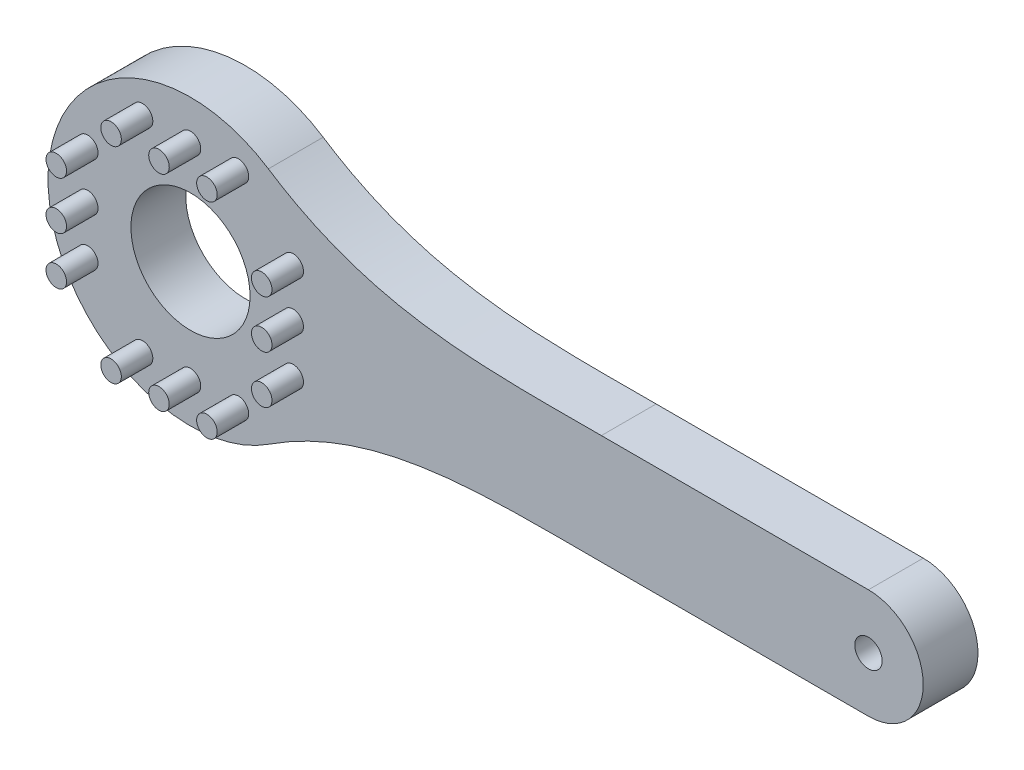
ISO-10303-21;
HEADER;
FILE_DESCRIPTION(('STEP AP214'),'2;1');
FILE_NAME('part.step','',(''),(''),'','','');
FILE_SCHEMA(('AUTOMOTIVE_DESIGN { 1 0 10303 214 1 1 1 1 }'));
ENDSEC;
DATA;
#1=APPLICATION_CONTEXT('core data for automotive mechanical design processes');
#2=APPLICATION_PROTOCOL_DEFINITION('international standard','automotive_design',2000,#1);
#3=PRODUCT_CONTEXT('',#1,'mechanical');
#4=PRODUCT('Part','Part','',(#3));
#5=PRODUCT_RELATED_PRODUCT_CATEGORY('part','',(#4));
#6=PRODUCT_DEFINITION_FORMATION('','',#4);
#7=PRODUCT_DEFINITION_CONTEXT('part definition',#1,'design');
#8=PRODUCT_DEFINITION('design','',#6,#7);
#9=PRODUCT_DEFINITION_SHAPE('','',#8);
#10=(LENGTH_UNIT() NAMED_UNIT(*) SI_UNIT(.MILLI.,.METRE.));
#11=(NAMED_UNIT(*) PLANE_ANGLE_UNIT() SI_UNIT($,.RADIAN.));
#12=(NAMED_UNIT(*) SI_UNIT($,.STERADIAN.) SOLID_ANGLE_UNIT());
#13=UNCERTAINTY_MEASURE_WITH_UNIT(LENGTH_MEASURE(1.E-05),#10,'distance_accuracy_value','');
#14=(GEOMETRIC_REPRESENTATION_CONTEXT(3) GLOBAL_UNCERTAINTY_ASSIGNED_CONTEXT((#13)) GLOBAL_UNIT_ASSIGNED_CONTEXT((#10,
#11,#12)) REPRESENTATION_CONTEXT('',''));
#15=CARTESIAN_POINT('',(0.,0.,0.));
#16=DIRECTION('',(0.,0.,1.));
#17=DIRECTION('',(1.,0.,0.));
#18=AXIS2_PLACEMENT_3D('',#15,#16,#17);
#19=CARTESIAN_POINT('',(17.4647591380404,4.46248690203293,4.));
#20=DIRECTION('',(0.,0.,-1.));
#21=DIRECTION('',(-1.,0.,0.));
#22=AXIS2_PLACEMENT_3D('',#19,#20,#21);
#23=PLANE('',#22);
#24=CARTESIAN_POINT('',(-7.5,3.5,4.));
#25=DIRECTION('',(0.,0.,-1.));
#26=DIRECTION('',(-1.,0.,0.));
#27=AXIS2_PLACEMENT_3D('',#24,#25,#26);
#28=CIRCLE('',#27,0.75);
#29=CARTESIAN_POINT('',(-8.25,3.5,4.));
#30=VERTEX_POINT('',#29);
#31=EDGE_CURVE('E11',#30,#30,#28,.F.);
#32=ORIENTED_EDGE('',*,*,#31,.F.);
#33=EDGE_LOOP('',(#32));
#34=FACE_BOUND('',#33,.T.);
#35=CARTESIAN_POINT('',(-7.5,0.,4.));
#36=DIRECTION('',(0.,0.,-1.));
#37=DIRECTION('',(-1.,0.,0.));
#38=AXIS2_PLACEMENT_3D('',#35,#36,#37);
#39=CIRCLE('',#38,0.749999999999998);
#40=CARTESIAN_POINT('',(-8.25,0.,4.));
#41=VERTEX_POINT('',#40);
#42=EDGE_CURVE('E49',#41,#41,#39,.F.);
#43=ORIENTED_EDGE('',*,*,#42,.F.);
#44=EDGE_LOOP('',(#43));
#45=FACE_BOUND('',#44,.T.);
#46=CARTESIAN_POINT('',(-7.5,-3.5,4.));
#47=DIRECTION('',(0.,0.,-1.));
#48=DIRECTION('',(-1.,0.,0.));
#49=AXIS2_PLACEMENT_3D('',#46,#47,#48);
#50=CIRCLE('',#49,0.75);
#51=CARTESIAN_POINT('',(-8.25,-3.5,4.));
#52=VERTEX_POINT('',#51);
#53=EDGE_CURVE('E183',#52,#52,#50,.F.);
#54=ORIENTED_EDGE('',*,*,#53,.F.);
#55=EDGE_LOOP('',(#54));
#56=FACE_BOUND('',#55,.T.);
#57=CARTESIAN_POINT('',(7.5,-3.5,4.));
#58=DIRECTION('',(0.,0.,-1.));
#59=DIRECTION('',(-1.,0.,0.));
#60=AXIS2_PLACEMENT_3D('',#57,#58,#59);
#61=CIRCLE('',#60,0.75);
#62=CARTESIAN_POINT('',(6.75,-3.5,4.));
#63=VERTEX_POINT('',#62);
#64=EDGE_CURVE('E180',#63,#63,#61,.F.);
#65=ORIENTED_EDGE('',*,*,#64,.F.);
#66=EDGE_LOOP('',(#65));
#67=FACE_BOUND('',#66,.T.);
#68=CARTESIAN_POINT('',(7.5,0.,4.));
#69=DIRECTION('',(0.,0.,-1.));
#70=DIRECTION('',(-1.,0.,0.));
#71=AXIS2_PLACEMENT_3D('',#68,#69,#70);
#72=CIRCLE('',#71,0.749999999999998);
#73=CARTESIAN_POINT('',(6.75,0.,4.));
#74=VERTEX_POINT('',#73);
#75=EDGE_CURVE('E177',#74,#74,#72,.F.);
#76=ORIENTED_EDGE('',*,*,#75,.F.);
#77=EDGE_LOOP('',(#76));
#78=FACE_BOUND('',#77,.T.);
#79=CARTESIAN_POINT('',(-3.5,-7.5,4.));
#80=DIRECTION('',(0.,0.,-1.));
#81=DIRECTION('',(-1.,0.,0.));
#82=AXIS2_PLACEMENT_3D('',#79,#80,#81);
#83=CIRCLE('',#82,0.749999999999999);
#84=CARTESIAN_POINT('',(-4.25,-7.5,4.));
#85=VERTEX_POINT('',#84);
#86=EDGE_CURVE('E174',#85,#85,#83,.F.);
#87=ORIENTED_EDGE('',*,*,#86,.F.);
#88=EDGE_LOOP('',(#87));
#89=FACE_BOUND('',#88,.T.);
#90=CARTESIAN_POINT('',(0.,-7.5,4.));
#91=DIRECTION('',(0.,0.,-1.));
#92=DIRECTION('',(-1.,0.,0.));
#93=AXIS2_PLACEMENT_3D('',#90,#91,#92);
#94=CIRCLE('',#93,0.75);
#95=CARTESIAN_POINT('',(-0.750000000000001,-7.5,4.));
#96=VERTEX_POINT('',#95);
#97=EDGE_CURVE('E171',#96,#96,#94,.F.);
#98=ORIENTED_EDGE('',*,*,#97,.F.);
#99=EDGE_LOOP('',(#98));
#100=FACE_BOUND('',#99,.T.);
#101=CARTESIAN_POINT('',(3.5,-7.5,4.));
#102=DIRECTION('',(0.,0.,-1.));
#103=DIRECTION('',(-1.,0.,0.));
#104=AXIS2_PLACEMENT_3D('',#101,#102,#103);
#105=CIRCLE('',#104,0.749999999999999);
#106=CARTESIAN_POINT('',(2.75,-7.5,4.));
#107=VERTEX_POINT('',#106);
#108=EDGE_CURVE('E168',#107,#107,#105,.F.);
#109=ORIENTED_EDGE('',*,*,#108,.F.);
#110=EDGE_LOOP('',(#109));
#111=FACE_BOUND('',#110,.T.);
#112=CARTESIAN_POINT('',(-3.5,7.5,4.));
#113=DIRECTION('',(0.,0.,-1.));
#114=DIRECTION('',(-1.,0.,0.));
#115=AXIS2_PLACEMENT_3D('',#112,#113,#114);
#116=CIRCLE('',#115,0.749999999999999);
#117=CARTESIAN_POINT('',(-4.25,7.5,4.));
#118=VERTEX_POINT('',#117);
#119=EDGE_CURVE('E165',#118,#118,#116,.F.);
#120=ORIENTED_EDGE('',*,*,#119,.F.);
#121=EDGE_LOOP('',(#120));
#122=FACE_BOUND('',#121,.T.);
#123=CARTESIAN_POINT('',(7.5,3.5,4.));
#124=DIRECTION('',(0.,0.,-1.));
#125=DIRECTION('',(-1.,0.,0.));
#126=AXIS2_PLACEMENT_3D('',#123,#124,#125);
#127=CIRCLE('',#126,0.75);
#128=CARTESIAN_POINT('',(6.75,3.5,4.));
#129=VERTEX_POINT('',#128);
#130=EDGE_CURVE('E162',#129,#129,#127,.F.);
#131=ORIENTED_EDGE('',*,*,#130,.F.);
#132=EDGE_LOOP('',(#131));
#133=FACE_BOUND('',#132,.T.);
#134=CARTESIAN_POINT('',(3.5,7.5,4.));
#135=DIRECTION('',(0.,0.,-1.));
#136=DIRECTION('',(-1.,0.,0.));
#137=AXIS2_PLACEMENT_3D('',#134,#135,#136);
#138=CIRCLE('',#137,0.749999999999999);
#139=CARTESIAN_POINT('',(2.75,7.5,4.));
#140=VERTEX_POINT('',#139);
#141=EDGE_CURVE('E159',#140,#140,#138,.F.);
#142=ORIENTED_EDGE('',*,*,#141,.F.);
#143=EDGE_LOOP('',(#142));
#144=FACE_BOUND('',#143,.T.);
#145=CARTESIAN_POINT('',(0.,7.5,4.));
#146=DIRECTION('',(0.,0.,-1.));
#147=DIRECTION('',(-1.,0.,0.));
#148=AXIS2_PLACEMENT_3D('',#145,#146,#147);
#149=CIRCLE('',#148,0.75);
#150=CARTESIAN_POINT('',(-0.750000000000001,7.5,4.));
#151=VERTEX_POINT('',#150);
#152=EDGE_CURVE('E156',#151,#151,#149,.F.);
#153=ORIENTED_EDGE('',*,*,#152,.F.);
#154=EDGE_LOOP('',(#153));
#155=FACE_BOUND('',#154,.T.);
#156=CARTESIAN_POINT('',(30.,4.,4.));
#157=CARTESIAN_POINT('',(21.2668653818899,4.,4.));
#158=CARTESIAN_POINT('',(13.4104279790372,3.66400440550072,4.));
#159=CARTESIAN_POINT('',(5.68619302154209,8.70788199976125,4.));
#160=B_SPLINE_CURVE_WITH_KNOTS('',3,(#156,#157,#158,#159),.UNSPECIFIED.,.F.,.F.,(4,4),(0.,1.),.UNSPECIFIED.);
#161=CARTESIAN_POINT('',(30.,4.,4.));
#162=VERTEX_POINT('',#161);
#163=CARTESIAN_POINT('',(5.68619302154209,8.70788199976125,4.));
#164=VERTEX_POINT('',#163);
#165=EDGE_CURVE('E147',#162,#164,#160,.T.);
#166=ORIENTED_EDGE('',*,*,#165,.T.);
#167=CARTESIAN_POINT('',(0.,0.,4.));
#168=DIRECTION('',(0.,0.,1.));
#169=DIRECTION('',(1.,0.,0.));
#170=AXIS2_PLACEMENT_3D('',#167,#168,#169);
#171=CIRCLE('',#170,10.4);
#172=CARTESIAN_POINT('',(5.68619302154209,-8.70788199976125,4.));
#173=VERTEX_POINT('',#172);
#174=EDGE_CURVE('E95',#164,#173,#171,.T.);
#175=ORIENTED_EDGE('',*,*,#174,.T.);
#176=CARTESIAN_POINT('',(5.68619302154209,-8.70788199976125,4.));
#177=CARTESIAN_POINT('',(13.4104279790372,-3.66400440550072,4.));
#178=CARTESIAN_POINT('',(21.2668653818899,-4.,4.));
#179=CARTESIAN_POINT('',(30.,-4.,4.));
#180=B_SPLINE_CURVE_WITH_KNOTS('',3,(#176,#177,#178,#179),.UNSPECIFIED.,.F.,.F.,(4,4),(0.,1.),.UNSPECIFIED.);
#181=CARTESIAN_POINT('',(30.,-4.,4.));
#182=VERTEX_POINT('',#181);
#183=EDGE_CURVE('E108',#173,#182,#180,.T.);
#184=ORIENTED_EDGE('',*,*,#183,.T.);
#185=DIRECTION('',(1.,0.,0.));
#186=VECTOR('',#185,1.);
#187=CARTESIAN_POINT('',(30.,-4.,4.));
#188=LINE('',#187,#186);
#189=CARTESIAN_POINT('',(49.5,-4.,4.));
#190=VERTEX_POINT('',#189);
#191=EDGE_CURVE('E102',#182,#190,#188,.T.);
#192=ORIENTED_EDGE('',*,*,#191,.T.);
#193=CARTESIAN_POINT('',(49.5,0.,4.));
#194=DIRECTION('',(0.,0.,1.));
#195=DIRECTION('',(-1.,0.,0.));
#196=AXIS2_PLACEMENT_3D('',#193,#194,#195);
#197=CIRCLE('',#196,4.);
#198=CARTESIAN_POINT('',(49.5,4.,4.));
#199=VERTEX_POINT('',#198);
#200=EDGE_CURVE('E106',#190,#199,#197,.T.);
#201=ORIENTED_EDGE('',*,*,#200,.T.);
#202=DIRECTION('',(-1.,0.,0.));
#203=VECTOR('',#202,1.);
#204=CARTESIAN_POINT('',(30.,4.,4.));
#205=LINE('',#204,#203);
#206=EDGE_CURVE('E57',#199,#162,#205,.T.);
#207=ORIENTED_EDGE('',*,*,#206,.T.);
#208=EDGE_LOOP('',(#166,#175,#184,#192,#201,#207));
#209=FACE_BOUND('',#208,.T.);
#210=CARTESIAN_POINT('',(49.5,0.,4.));
#211=DIRECTION('',(0.,0.,1.));
#212=DIRECTION('',(1.,0.,0.));
#213=AXIS2_PLACEMENT_3D('',#210,#211,#212);
#214=CIRCLE('',#213,0.999999999999998);
#215=CARTESIAN_POINT('',(50.5,0.,4.));
#216=VERTEX_POINT('',#215);
#217=EDGE_CURVE('E132',#216,#216,#214,.T.);
#218=ORIENTED_EDGE('',*,*,#217,.F.);
#219=EDGE_LOOP('',(#218));
#220=FACE_BOUND('',#219,.T.);
#221=CARTESIAN_POINT('',(0.,0.,4.));
#222=DIRECTION('',(0.,0.,1.));
#223=DIRECTION('',(1.,0.,0.));
#224=AXIS2_PLACEMENT_3D('',#221,#222,#223);
#225=CIRCLE('',#224,4.35);
#226=CARTESIAN_POINT('',(4.35,0.,4.));
#227=VERTEX_POINT('',#226);
#228=EDGE_CURVE('E268',#227,#227,#225,.T.);
#229=ORIENTED_EDGE('',*,*,#228,.F.);
#230=EDGE_LOOP('',(#229));
#231=FACE_BOUND('',#230,.T.);
#232=ADVANCED_FACE('F39',(#34,#45,#56,#67,#78,#89,#100,#111,#122,#133,#144,#155,#209,#220,#231),
#23,.F.);
#233=CARTESIAN_POINT('',(17.4647591380404,4.46248690203293,0.));
#234=DIRECTION('',(0.,0.,-1.));
#235=DIRECTION('',(-1.,0.,0.));
#236=AXIS2_PLACEMENT_3D('',#233,#234,#235);
#237=PLANE('',#236);
#238=CARTESIAN_POINT('',(49.5,0.,0.));
#239=DIRECTION('',(0.,0.,1.));
#240=DIRECTION('',(1.,0.,0.));
#241=AXIS2_PLACEMENT_3D('',#238,#239,#240);
#242=CIRCLE('',#241,0.999999999999998);
#243=CARTESIAN_POINT('',(50.5,0.,0.));
#244=VERTEX_POINT('',#243);
#245=EDGE_CURVE('E262',#244,#244,#242,.T.);
#246=ORIENTED_EDGE('',*,*,#245,.T.);
#247=EDGE_LOOP('',(#246));
#248=FACE_BOUND('',#247,.T.);
#249=CARTESIAN_POINT('',(30.,4.,0.));
#250=CARTESIAN_POINT('',(21.2668653818899,4.,0.));
#251=CARTESIAN_POINT('',(13.4104279790372,3.66400440550072,0.));
#252=CARTESIAN_POINT('',(5.68619302154209,8.70788199976125,0.));
#253=B_SPLINE_CURVE_WITH_KNOTS('',3,(#249,#250,#251,#252),.UNSPECIFIED.,.F.,.F.,(4,4),(0.,1.),.UNSPECIFIED.);
#254=CARTESIAN_POINT('',(30.,4.,0.));
#255=VERTEX_POINT('',#254);
#256=CARTESIAN_POINT('',(5.68619302154209,8.70788199976125,0.));
#257=VERTEX_POINT('',#256);
#258=EDGE_CURVE('E126',#255,#257,#253,.T.);
#259=ORIENTED_EDGE('',*,*,#258,.F.);
#260=DIRECTION('',(-1.,0.,0.));
#261=VECTOR('',#260,1.);
#262=CARTESIAN_POINT('',(30.,4.,0.));
#263=LINE('',#262,#261);
#264=CARTESIAN_POINT('',(49.5,4.,0.));
#265=VERTEX_POINT('',#264);
#266=EDGE_CURVE('E86',#265,#255,#263,.T.);
#267=ORIENTED_EDGE('',*,*,#266,.F.);
#268=CARTESIAN_POINT('',(49.5,0.,0.));
#269=DIRECTION('',(0.,0.,1.));
#270=DIRECTION('',(-1.,0.,0.));
#271=AXIS2_PLACEMENT_3D('',#268,#269,#270);
#272=CIRCLE('',#271,4.);
#273=CARTESIAN_POINT('',(49.5,-4.,0.));
#274=VERTEX_POINT('',#273);
#275=EDGE_CURVE('E80',#274,#265,#272,.T.);
#276=ORIENTED_EDGE('',*,*,#275,.F.);
#277=DIRECTION('',(1.,0.,0.));
#278=VECTOR('',#277,1.);
#279=CARTESIAN_POINT('',(30.,-4.,0.));
#280=LINE('',#279,#278);
#281=CARTESIAN_POINT('',(30.,-4.,0.));
#282=VERTEX_POINT('',#281);
#283=EDGE_CURVE('E116',#282,#274,#280,.T.);
#284=ORIENTED_EDGE('',*,*,#283,.F.);
#285=CARTESIAN_POINT('',(5.68619302154209,-8.70788199976125,0.));
#286=CARTESIAN_POINT('',(13.4104279790372,-3.66400440550072,0.));
#287=CARTESIAN_POINT('',(21.2668653818899,-4.,0.));
#288=CARTESIAN_POINT('',(30.,-4.,0.));
#289=B_SPLINE_CURVE_WITH_KNOTS('',3,(#285,#286,#287,#288),.UNSPECIFIED.,.F.,.F.,(4,4),(0.,1.),.UNSPECIFIED.);
#290=CARTESIAN_POINT('',(5.68619302154209,-8.70788199976125,0.));
#291=VERTEX_POINT('',#290);
#292=EDGE_CURVE('E137',#291,#282,#289,.T.);
#293=ORIENTED_EDGE('',*,*,#292,.F.);
#294=CARTESIAN_POINT('',(0.,0.,0.));
#295=DIRECTION('',(0.,0.,1.));
#296=DIRECTION('',(1.,0.,0.));
#297=AXIS2_PLACEMENT_3D('',#294,#295,#296);
#298=CIRCLE('',#297,10.4);
#299=EDGE_CURVE('E131',#257,#291,#298,.T.);
#300=ORIENTED_EDGE('',*,*,#299,.F.);
#301=EDGE_LOOP('',(#259,#267,#276,#284,#293,#300));
#302=FACE_BOUND('',#301,.T.);
#303=CARTESIAN_POINT('',(0.,0.,0.));
#304=DIRECTION('',(0.,0.,1.));
#305=DIRECTION('',(1.,0.,0.));
#306=AXIS2_PLACEMENT_3D('',#303,#304,#305);
#307=CIRCLE('',#306,4.35);
#308=CARTESIAN_POINT('',(4.35,0.,0.));
#309=VERTEX_POINT('',#308);
#310=EDGE_CURVE('E271',#309,#309,#307,.T.);
#311=ORIENTED_EDGE('',*,*,#310,.T.);
#312=EDGE_LOOP('',(#311));
#313=FACE_BOUND('',#312,.T.);
#314=ADVANCED_FACE('F192',(#248,#302,#313),#237,.T.);
#315=DIRECTION('',(0.,0.,-1.));
#316=VECTOR('',#315,1.);
#317=SURFACE_OF_LINEAR_EXTRUSION('',#160,#316);
#318=ORIENTED_EDGE('',*,*,#258,.T.);
#319=DIRECTION('',(0.,0.,-1.));
#320=VECTOR('',#319,1.);
#321=CARTESIAN_POINT('',(5.68619302154209,8.70788199976125,4.));
#322=LINE('',#321,#320);
#323=EDGE_CURVE('E154',#164,#257,#322,.T.);
#324=ORIENTED_EDGE('',*,*,#323,.F.);
#325=ORIENTED_EDGE('',*,*,#165,.F.);
#326=DIRECTION('',(0.,0.,-1.));
#327=VECTOR('',#326,1.);
#328=CARTESIAN_POINT('',(30.,4.,4.));
#329=LINE('',#328,#327);
#330=EDGE_CURVE('E122',#162,#255,#329,.T.);
#331=ORIENTED_EDGE('',*,*,#330,.T.);
#332=EDGE_LOOP('',(#318,#324,#325,#331));
#333=FACE_BOUND('',#332,.T.);
#334=ADVANCED_FACE('F41',(#333),#317,.F.);
#335=CARTESIAN_POINT('',(0.,0.,4.));
#336=DIRECTION('',(0.,0.,-1.));
#337=DIRECTION('',(-1.,0.,0.));
#338=AXIS2_PLACEMENT_3D('',#335,#336,#337);
#339=CYLINDRICAL_SURFACE('',#338,10.4);
#340=ORIENTED_EDGE('',*,*,#299,.T.);
#341=DIRECTION('',(0.,0.,-1.));
#342=VECTOR('',#341,1.);
#343=CARTESIAN_POINT('',(5.68619302154209,-8.70788199976125,4.));
#344=LINE('',#343,#342);
#345=EDGE_CURVE('E151',#173,#291,#344,.T.);
#346=ORIENTED_EDGE('',*,*,#345,.F.);
#347=ORIENTED_EDGE('',*,*,#174,.F.);
#348=ORIENTED_EDGE('',*,*,#323,.T.);
#349=EDGE_LOOP('',(#340,#346,#347,#348));
#350=FACE_BOUND('',#349,.T.);
#351=ADVANCED_FACE('F249',(#350),#339,.T.);
#352=DIRECTION('',(0.,0.,-1.));
#353=VECTOR('',#352,1.);
#354=SURFACE_OF_LINEAR_EXTRUSION('',#180,#353);
#355=ORIENTED_EDGE('',*,*,#292,.T.);
#356=DIRECTION('',(0.,0.,-1.));
#357=VECTOR('',#356,1.);
#358=CARTESIAN_POINT('',(30.,-4.,4.));
#359=LINE('',#358,#357);
#360=EDGE_CURVE('E117',#182,#282,#359,.T.);
#361=ORIENTED_EDGE('',*,*,#360,.F.);
#362=ORIENTED_EDGE('',*,*,#183,.F.);
#363=ORIENTED_EDGE('',*,*,#345,.T.);
#364=EDGE_LOOP('',(#355,#361,#362,#363));
#365=FACE_BOUND('',#364,.T.);
#366=ADVANCED_FACE('F247',(#365),#354,.F.);
#367=CARTESIAN_POINT('',(30.,-4.,4.));
#368=DIRECTION('',(0.,1.,0.));
#369=DIRECTION('',(0.,0.,1.));
#370=AXIS2_PLACEMENT_3D('',#367,#368,#369);
#371=PLANE('',#370);
#372=ORIENTED_EDGE('',*,*,#283,.T.);
#373=DIRECTION('',(0.,0.,-1.));
#374=VECTOR('',#373,1.);
#375=CARTESIAN_POINT('',(49.5,-4.,4.));
#376=LINE('',#375,#374);
#377=EDGE_CURVE('E113',#190,#274,#376,.T.);
#378=ORIENTED_EDGE('',*,*,#377,.F.);
#379=ORIENTED_EDGE('',*,*,#191,.F.);
#380=ORIENTED_EDGE('',*,*,#360,.T.);
#381=EDGE_LOOP('',(#372,#378,#379,#380));
#382=FACE_BOUND('',#381,.T.);
#383=ADVANCED_FACE('F114',(#382),#371,.F.);
#384=CARTESIAN_POINT('',(49.5,0.,4.));
#385=DIRECTION('',(0.,0.,-1.));
#386=DIRECTION('',(-1.,0.,0.));
#387=AXIS2_PLACEMENT_3D('',#384,#385,#386);
#388=CYLINDRICAL_SURFACE('',#387,4.);
#389=ORIENTED_EDGE('',*,*,#275,.T.);
#390=DIRECTION('',(0.,0.,-1.));
#391=VECTOR('',#390,1.);
#392=CARTESIAN_POINT('',(49.5,4.,4.));
#393=LINE('',#392,#391);
#394=EDGE_CURVE('E118',#199,#265,#393,.T.);
#395=ORIENTED_EDGE('',*,*,#394,.F.);
#396=ORIENTED_EDGE('',*,*,#200,.F.);
#397=ORIENTED_EDGE('',*,*,#377,.T.);
#398=EDGE_LOOP('',(#389,#395,#396,#397));
#399=FACE_BOUND('',#398,.T.);
#400=ADVANCED_FACE('F120',(#399),#388,.T.);
#401=CARTESIAN_POINT('',(30.,4.,4.));
#402=DIRECTION('',(0.,-1.,0.));
#403=DIRECTION('',(0.,0.,-1.));
#404=AXIS2_PLACEMENT_3D('',#401,#402,#403);
#405=PLANE('',#404);
#406=ORIENTED_EDGE('',*,*,#266,.T.);
#407=ORIENTED_EDGE('',*,*,#330,.F.);
#408=ORIENTED_EDGE('',*,*,#206,.F.);
#409=ORIENTED_EDGE('',*,*,#394,.T.);
#410=EDGE_LOOP('',(#406,#407,#408,#409));
#411=FACE_BOUND('',#410,.T.);
#412=ADVANCED_FACE('F235',(#411),#405,.F.);
#413=CARTESIAN_POINT('',(49.5,0.,4.));
#414=DIRECTION('',(0.,0.,-1.));
#415=DIRECTION('',(-1.,0.,0.));
#416=AXIS2_PLACEMENT_3D('',#413,#414,#415);
#417=CYLINDRICAL_SURFACE('',#416,0.999999999999998);
#418=ORIENTED_EDGE('',*,*,#217,.T.);
#419=EDGE_LOOP('',(#418));
#420=FACE_BOUND('',#419,.T.);
#421=ORIENTED_EDGE('',*,*,#245,.F.);
#422=EDGE_LOOP('',(#421));
#423=FACE_BOUND('',#422,.T.);
#424=ADVANCED_FACE('F228',(#420,#423),#417,.F.);
#425=CARTESIAN_POINT('',(0.,0.,4.));
#426=DIRECTION('',(0.,0.,-1.));
#427=DIRECTION('',(-1.,0.,0.));
#428=AXIS2_PLACEMENT_3D('',#425,#426,#427);
#429=CYLINDRICAL_SURFACE('',#428,4.35);
#430=ORIENTED_EDGE('',*,*,#228,.T.);
#431=EDGE_LOOP('',(#430));
#432=FACE_BOUND('',#431,.T.);
#433=ORIENTED_EDGE('',*,*,#310,.F.);
#434=EDGE_LOOP('',(#433));
#435=FACE_BOUND('',#434,.T.);
#436=ADVANCED_FACE('F218',(#432,#435),#429,.F.);
#437=CARTESIAN_POINT('',(0.,7.5,6.3));
#438=DIRECTION('',(0.,0.,-1.));
#439=DIRECTION('',(-1.,0.,0.));
#440=AXIS2_PLACEMENT_3D('',#437,#438,#439);
#441=CYLINDRICAL_SURFACE('',#440,0.75);
#442=CARTESIAN_POINT('',(0.,7.5,6.3));
#443=DIRECTION('',(0.,0.,1.));
#444=DIRECTION('',(1.,0.,0.));
#445=AXIS2_PLACEMENT_3D('',#442,#443,#444);
#446=CIRCLE('',#445,0.75);
#447=CARTESIAN_POINT('',(0.749999999999999,7.5,6.3));
#448=VERTEX_POINT('',#447);
#449=EDGE_CURVE('E274',#448,#448,#446,.T.);
#450=ORIENTED_EDGE('',*,*,#449,.F.);
#451=EDGE_LOOP('',(#450));
#452=FACE_BOUND('',#451,.T.);
#453=ORIENTED_EDGE('',*,*,#152,.T.);
#454=EDGE_LOOP('',(#453));
#455=FACE_BOUND('',#454,.T.);
#456=ADVANCED_FACE('F215',(#452,#455),#441,.T.);
#457=CARTESIAN_POINT('',(0.,7.5,6.3));
#458=DIRECTION('',(0.,0.,1.));
#459=DIRECTION('',(1.,0.,0.));
#460=AXIS2_PLACEMENT_3D('',#457,#458,#459);
#461=PLANE('',#460);
#462=ORIENTED_EDGE('',*,*,#449,.T.);
#463=EDGE_LOOP('',(#462));
#464=FACE_BOUND('',#463,.T.);
#465=ADVANCED_FACE('F217',(#464),#461,.T.);
#466=CARTESIAN_POINT('',(3.5,7.5,6.3));
#467=DIRECTION('',(0.,0.,-1.));
#468=DIRECTION('',(-1.,0.,0.));
#469=AXIS2_PLACEMENT_3D('',#466,#467,#468);
#470=CYLINDRICAL_SURFACE('',#469,0.749999999999999);
#471=CARTESIAN_POINT('',(3.5,7.5,6.3));
#472=DIRECTION('',(0.,0.,1.));
#473=DIRECTION('',(1.,0.,0.));
#474=AXIS2_PLACEMENT_3D('',#471,#472,#473);
#475=CIRCLE('',#474,0.749999999999999);
#476=CARTESIAN_POINT('',(4.25,7.5,6.3));
#477=VERTEX_POINT('',#476);
#478=EDGE_CURVE('E279',#477,#477,#475,.T.);
#479=ORIENTED_EDGE('',*,*,#478,.F.);
#480=EDGE_LOOP('',(#479));
#481=FACE_BOUND('',#480,.T.);
#482=ORIENTED_EDGE('',*,*,#141,.T.);
#483=EDGE_LOOP('',(#482));
#484=FACE_BOUND('',#483,.T.);
#485=ADVANCED_FACE('F225',(#481,#484),#470,.T.);
#486=CARTESIAN_POINT('',(3.5,7.5,6.3));
#487=DIRECTION('',(0.,0.,1.));
#488=DIRECTION('',(1.,0.,0.));
#489=AXIS2_PLACEMENT_3D('',#486,#487,#488);
#490=PLANE('',#489);
#491=ORIENTED_EDGE('',*,*,#478,.T.);
#492=EDGE_LOOP('',(#491));
#493=FACE_BOUND('',#492,.T.);
#494=ADVANCED_FACE('F395',(#493),#490,.T.);
#495=CARTESIAN_POINT('',(7.5,3.5,6.3));
#496=DIRECTION('',(0.,0.,-1.));
#497=DIRECTION('',(-1.,0.,0.));
#498=AXIS2_PLACEMENT_3D('',#495,#496,#497);
#499=CYLINDRICAL_SURFACE('',#498,0.75);
#500=CARTESIAN_POINT('',(7.5,3.5,6.3));
#501=DIRECTION('',(0.,0.,1.));
#502=DIRECTION('',(1.,0.,0.));
#503=AXIS2_PLACEMENT_3D('',#500,#501,#502);
#504=CIRCLE('',#503,0.75);
#505=CARTESIAN_POINT('',(8.25,3.5,6.3));
#506=VERTEX_POINT('',#505);
#507=EDGE_CURVE('E282',#506,#506,#504,.T.);
#508=ORIENTED_EDGE('',*,*,#507,.F.);
#509=EDGE_LOOP('',(#508));
#510=FACE_BOUND('',#509,.T.);
#511=ORIENTED_EDGE('',*,*,#130,.T.);
#512=EDGE_LOOP('',(#511));
#513=FACE_BOUND('',#512,.T.);
#514=ADVANCED_FACE('F391',(#510,#513),#499,.T.);
#515=CARTESIAN_POINT('',(7.5,3.5,6.3));
#516=DIRECTION('',(0.,0.,1.));
#517=DIRECTION('',(1.,0.,0.));
#518=AXIS2_PLACEMENT_3D('',#515,#516,#517);
#519=PLANE('',#518);
#520=ORIENTED_EDGE('',*,*,#507,.T.);
#521=EDGE_LOOP('',(#520));
#522=FACE_BOUND('',#521,.T.);
#523=ADVANCED_FACE('F387',(#522),#519,.T.);
#524=CARTESIAN_POINT('',(-3.5,7.5,6.3));
#525=DIRECTION('',(0.,0.,-1.));
#526=DIRECTION('',(-1.,0.,0.));
#527=AXIS2_PLACEMENT_3D('',#524,#525,#526);
#528=CYLINDRICAL_SURFACE('',#527,0.749999999999999);
#529=CARTESIAN_POINT('',(-3.5,7.5,6.3));
#530=DIRECTION('',(0.,0.,1.));
#531=DIRECTION('',(-1.,0.,0.));
#532=AXIS2_PLACEMENT_3D('',#529,#530,#531);
#533=CIRCLE('',#532,0.749999999999999);
#534=CARTESIAN_POINT('',(-4.25,7.5,6.3));
#535=VERTEX_POINT('',#534);
#536=EDGE_CURVE('E285',#535,#535,#533,.T.);
#537=ORIENTED_EDGE('',*,*,#536,.F.);
#538=EDGE_LOOP('',(#537));
#539=FACE_BOUND('',#538,.T.);
#540=ORIENTED_EDGE('',*,*,#119,.T.);
#541=EDGE_LOOP('',(#540));
#542=FACE_BOUND('',#541,.T.);
#543=ADVANCED_FACE('F383',(#539,#542),#528,.T.);
#544=CARTESIAN_POINT('',(-3.5,7.5,6.3));
#545=DIRECTION('',(0.,0.,-1.));
#546=DIRECTION('',(-1.,0.,0.));
#547=AXIS2_PLACEMENT_3D('',#544,#545,#546);
#548=PLANE('',#547);
#549=ORIENTED_EDGE('',*,*,#536,.T.);
#550=EDGE_LOOP('',(#549));
#551=FACE_BOUND('',#550,.T.);
#552=ADVANCED_FACE('F379',(#551),#548,.F.);
#553=CARTESIAN_POINT('',(3.5,-7.5,6.3));
#554=DIRECTION('',(0.,0.,-1.));
#555=DIRECTION('',(-1.,0.,0.));
#556=AXIS2_PLACEMENT_3D('',#553,#554,#555);
#557=CYLINDRICAL_SURFACE('',#556,0.749999999999999);
#558=CARTESIAN_POINT('',(3.5,-7.5,6.3));
#559=DIRECTION('',(0.,0.,1.));
#560=DIRECTION('',(-1.,0.,0.));
#561=AXIS2_PLACEMENT_3D('',#558,#559,#560);
#562=CIRCLE('',#561,0.749999999999999);
#563=CARTESIAN_POINT('',(2.75,-7.5,6.3));
#564=VERTEX_POINT('',#563);
#565=EDGE_CURVE('E288',#564,#564,#562,.T.);
#566=ORIENTED_EDGE('',*,*,#565,.F.);
#567=EDGE_LOOP('',(#566));
#568=FACE_BOUND('',#567,.T.);
#569=ORIENTED_EDGE('',*,*,#108,.T.);
#570=EDGE_LOOP('',(#569));
#571=FACE_BOUND('',#570,.T.);
#572=ADVANCED_FACE('F375',(#568,#571),#557,.T.);
#573=CARTESIAN_POINT('',(3.5,-7.5,6.3));
#574=DIRECTION('',(0.,0.,-1.));
#575=DIRECTION('',(-1.,0.,0.));
#576=AXIS2_PLACEMENT_3D('',#573,#574,#575);
#577=PLANE('',#576);
#578=ORIENTED_EDGE('',*,*,#565,.T.);
#579=EDGE_LOOP('',(#578));
#580=FACE_BOUND('',#579,.T.);
#581=ADVANCED_FACE('F371',(#580),#577,.F.);
#582=CARTESIAN_POINT('',(0.,-7.5,6.3));
#583=DIRECTION('',(0.,0.,-1.));
#584=DIRECTION('',(-1.,0.,0.));
#585=AXIS2_PLACEMENT_3D('',#582,#583,#584);
#586=CYLINDRICAL_SURFACE('',#585,0.75);
#587=CARTESIAN_POINT('',(0.,-7.5,6.3));
#588=DIRECTION('',(0.,0.,1.));
#589=DIRECTION('',(-1.,0.,0.));
#590=AXIS2_PLACEMENT_3D('',#587,#588,#589);
#591=CIRCLE('',#590,0.75);
#592=CARTESIAN_POINT('',(-0.750000000000001,-7.5,6.3));
#593=VERTEX_POINT('',#592);
#594=EDGE_CURVE('E291',#593,#593,#591,.T.);
#595=ORIENTED_EDGE('',*,*,#594,.F.);
#596=EDGE_LOOP('',(#595));
#597=FACE_BOUND('',#596,.T.);
#598=ORIENTED_EDGE('',*,*,#97,.T.);
#599=EDGE_LOOP('',(#598));
#600=FACE_BOUND('',#599,.T.);
#601=ADVANCED_FACE('F367',(#597,#600),#586,.T.);
#602=CARTESIAN_POINT('',(0.,-7.5,6.3));
#603=DIRECTION('',(0.,0.,-1.));
#604=DIRECTION('',(-1.,0.,0.));
#605=AXIS2_PLACEMENT_3D('',#602,#603,#604);
#606=PLANE('',#605);
#607=ORIENTED_EDGE('',*,*,#594,.T.);
#608=EDGE_LOOP('',(#607));
#609=FACE_BOUND('',#608,.T.);
#610=ADVANCED_FACE('F363',(#609),#606,.F.);
#611=CARTESIAN_POINT('',(-3.5,-7.5,6.3));
#612=DIRECTION('',(0.,0.,-1.));
#613=DIRECTION('',(-1.,0.,0.));
#614=AXIS2_PLACEMENT_3D('',#611,#612,#613);
#615=CYLINDRICAL_SURFACE('',#614,0.749999999999999);
#616=CARTESIAN_POINT('',(-3.5,-7.5,6.3));
#617=DIRECTION('',(0.,0.,1.));
#618=DIRECTION('',(1.,0.,0.));
#619=AXIS2_PLACEMENT_3D('',#616,#617,#618);
#620=CIRCLE('',#619,0.749999999999999);
#621=CARTESIAN_POINT('',(-2.75,-7.5,6.3));
#622=VERTEX_POINT('',#621);
#623=EDGE_CURVE('E294',#622,#622,#620,.T.);
#624=ORIENTED_EDGE('',*,*,#623,.F.);
#625=EDGE_LOOP('',(#624));
#626=FACE_BOUND('',#625,.T.);
#627=ORIENTED_EDGE('',*,*,#86,.T.);
#628=EDGE_LOOP('',(#627));
#629=FACE_BOUND('',#628,.T.);
#630=ADVANCED_FACE('F359',(#626,#629),#615,.T.);
#631=CARTESIAN_POINT('',(-3.5,-7.5,6.3));
#632=DIRECTION('',(0.,0.,1.));
#633=DIRECTION('',(1.,0.,0.));
#634=AXIS2_PLACEMENT_3D('',#631,#632,#633);
#635=PLANE('',#634);
#636=ORIENTED_EDGE('',*,*,#623,.T.);
#637=EDGE_LOOP('',(#636));
#638=FACE_BOUND('',#637,.T.);
#639=ADVANCED_FACE('F355',(#638),#635,.T.);
#640=CARTESIAN_POINT('',(7.5,0.,6.3));
#641=DIRECTION('',(0.,0.,-1.));
#642=DIRECTION('',(-1.,0.,0.));
#643=AXIS2_PLACEMENT_3D('',#640,#641,#642);
#644=CYLINDRICAL_SURFACE('',#643,0.749999999999998);
#645=CARTESIAN_POINT('',(7.5,0.,6.3));
#646=DIRECTION('',(0.,0.,1.));
#647=DIRECTION('',(1.,0.,0.));
#648=AXIS2_PLACEMENT_3D('',#645,#646,#647);
#649=CIRCLE('',#648,0.749999999999998);
#650=CARTESIAN_POINT('',(8.25,0.,6.3));
#651=VERTEX_POINT('',#650);
#652=EDGE_CURVE('E297',#651,#651,#649,.T.);
#653=ORIENTED_EDGE('',*,*,#652,.F.);
#654=EDGE_LOOP('',(#653));
#655=FACE_BOUND('',#654,.T.);
#656=ORIENTED_EDGE('',*,*,#75,.T.);
#657=EDGE_LOOP('',(#656));
#658=FACE_BOUND('',#657,.T.);
#659=ADVANCED_FACE('F351',(#655,#658),#644,.T.);
#660=CARTESIAN_POINT('',(7.5,0.,6.3));
#661=DIRECTION('',(0.,0.,1.));
#662=DIRECTION('',(1.,0.,0.));
#663=AXIS2_PLACEMENT_3D('',#660,#661,#662);
#664=PLANE('',#663);
#665=ORIENTED_EDGE('',*,*,#652,.T.);
#666=EDGE_LOOP('',(#665));
#667=FACE_BOUND('',#666,.T.);
#668=ADVANCED_FACE('F347',(#667),#664,.T.);
#669=CARTESIAN_POINT('',(7.5,-3.5,6.3));
#670=DIRECTION('',(0.,0.,-1.));
#671=DIRECTION('',(-1.,0.,0.));
#672=AXIS2_PLACEMENT_3D('',#669,#670,#671);
#673=CYLINDRICAL_SURFACE('',#672,0.75);
#674=CARTESIAN_POINT('',(7.5,-3.5,6.3));
#675=DIRECTION('',(0.,0.,1.));
#676=DIRECTION('',(-1.,0.,0.));
#677=AXIS2_PLACEMENT_3D('',#674,#675,#676);
#678=CIRCLE('',#677,0.75);
#679=CARTESIAN_POINT('',(6.75,-3.5,6.3));
#680=VERTEX_POINT('',#679);
#681=EDGE_CURVE('E300',#680,#680,#678,.T.);
#682=ORIENTED_EDGE('',*,*,#681,.F.);
#683=EDGE_LOOP('',(#682));
#684=FACE_BOUND('',#683,.T.);
#685=ORIENTED_EDGE('',*,*,#64,.T.);
#686=EDGE_LOOP('',(#685));
#687=FACE_BOUND('',#686,.T.);
#688=ADVANCED_FACE('F343',(#684,#687),#673,.T.);
#689=CARTESIAN_POINT('',(7.5,-3.5,6.3));
#690=DIRECTION('',(0.,0.,-1.));
#691=DIRECTION('',(-1.,0.,0.));
#692=AXIS2_PLACEMENT_3D('',#689,#690,#691);
#693=PLANE('',#692);
#694=ORIENTED_EDGE('',*,*,#681,.T.);
#695=EDGE_LOOP('',(#694));
#696=FACE_BOUND('',#695,.T.);
#697=ADVANCED_FACE('F339',(#696),#693,.F.);
#698=CARTESIAN_POINT('',(-7.5,-3.5,6.3));
#699=DIRECTION('',(0.,0.,-1.));
#700=DIRECTION('',(-1.,0.,0.));
#701=AXIS2_PLACEMENT_3D('',#698,#699,#700);
#702=CYLINDRICAL_SURFACE('',#701,0.75);
#703=CARTESIAN_POINT('',(-7.5,-3.5,6.3));
#704=DIRECTION('',(0.,0.,1.));
#705=DIRECTION('',(1.,0.,0.));
#706=AXIS2_PLACEMENT_3D('',#703,#704,#705);
#707=CIRCLE('',#706,0.75);
#708=CARTESIAN_POINT('',(-6.75,-3.5,6.3));
#709=VERTEX_POINT('',#708);
#710=EDGE_CURVE('E303',#709,#709,#707,.T.);
#711=ORIENTED_EDGE('',*,*,#710,.F.);
#712=EDGE_LOOP('',(#711));
#713=FACE_BOUND('',#712,.T.);
#714=ORIENTED_EDGE('',*,*,#53,.T.);
#715=EDGE_LOOP('',(#714));
#716=FACE_BOUND('',#715,.T.);
#717=ADVANCED_FACE('F335',(#713,#716),#702,.T.);
#718=CARTESIAN_POINT('',(-7.5,-3.5,6.3));
#719=DIRECTION('',(0.,0.,1.));
#720=DIRECTION('',(1.,0.,0.));
#721=AXIS2_PLACEMENT_3D('',#718,#719,#720);
#722=PLANE('',#721);
#723=ORIENTED_EDGE('',*,*,#710,.T.);
#724=EDGE_LOOP('',(#723));
#725=FACE_BOUND('',#724,.T.);
#726=ADVANCED_FACE('F331',(#725),#722,.T.);
#727=CARTESIAN_POINT('',(-7.5,0.,6.3));
#728=DIRECTION('',(0.,0.,-1.));
#729=DIRECTION('',(-1.,0.,0.));
#730=AXIS2_PLACEMENT_3D('',#727,#728,#729);
#731=CYLINDRICAL_SURFACE('',#730,0.749999999999998);
#732=CARTESIAN_POINT('',(-7.5,0.,6.3));
#733=DIRECTION('',(0.,0.,1.));
#734=DIRECTION('',(-1.,0.,0.));
#735=AXIS2_PLACEMENT_3D('',#732,#733,#734);
#736=CIRCLE('',#735,0.749999999999998);
#737=CARTESIAN_POINT('',(-8.25,0.,6.3));
#738=VERTEX_POINT('',#737);
#739=EDGE_CURVE('E306',#738,#738,#736,.T.);
#740=ORIENTED_EDGE('',*,*,#739,.F.);
#741=EDGE_LOOP('',(#740));
#742=FACE_BOUND('',#741,.T.);
#743=ORIENTED_EDGE('',*,*,#42,.T.);
#744=EDGE_LOOP('',(#743));
#745=FACE_BOUND('',#744,.T.);
#746=ADVANCED_FACE('F188',(#742,#745),#731,.T.);
#747=CARTESIAN_POINT('',(-7.5,0.,6.3));
#748=DIRECTION('',(0.,0.,-1.));
#749=DIRECTION('',(-1.,0.,0.));
#750=AXIS2_PLACEMENT_3D('',#747,#748,#749);
#751=PLANE('',#750);
#752=ORIENTED_EDGE('',*,*,#739,.T.);
#753=EDGE_LOOP('',(#752));
#754=FACE_BOUND('',#753,.T.);
#755=ADVANCED_FACE('F318',(#754),#751,.F.);
#756=CARTESIAN_POINT('',(-7.5,3.5,6.3));
#757=DIRECTION('',(0.,0.,-1.));
#758=DIRECTION('',(-1.,0.,0.));
#759=AXIS2_PLACEMENT_3D('',#756,#757,#758);
#760=CYLINDRICAL_SURFACE('',#759,0.75);
#761=CARTESIAN_POINT('',(-7.5,3.5,6.3));
#762=DIRECTION('',(0.,0.,1.));
#763=DIRECTION('',(-1.,0.,0.));
#764=AXIS2_PLACEMENT_3D('',#761,#762,#763);
#765=CIRCLE('',#764,0.75);
#766=CARTESIAN_POINT('',(-8.25,3.5,6.3));
#767=VERTEX_POINT('',#766);
#768=EDGE_CURVE('E309',#767,#767,#765,.T.);
#769=ORIENTED_EDGE('',*,*,#768,.F.);
#770=EDGE_LOOP('',(#769));
#771=FACE_BOUND('',#770,.T.);
#772=ORIENTED_EDGE('',*,*,#31,.T.);
#773=EDGE_LOOP('',(#772));
#774=FACE_BOUND('',#773,.T.);
#775=ADVANCED_FACE('F315',(#771,#774),#760,.T.);
#776=CARTESIAN_POINT('',(-7.5,3.5,6.3));
#777=DIRECTION('',(0.,0.,-1.));
#778=DIRECTION('',(-1.,0.,0.));
#779=AXIS2_PLACEMENT_3D('',#776,#777,#778);
#780=PLANE('',#779);
#781=ORIENTED_EDGE('',*,*,#768,.T.);
#782=EDGE_LOOP('',(#781));
#783=FACE_BOUND('',#782,.T.);
#784=ADVANCED_FACE('F313',(#783),#780,.F.);
#785=CLOSED_SHELL('',(#232,#314,#334,#351,#366,#383,#400,#412,#424,#436,#456,#465,#485,#494,
#514,#523,#543,#552,#572,#581,#601,#610,#630,#639,#659,#668,#688,#697,#717,#726,#746,#755,#775,#784));
#786=MANIFOLD_SOLID_BREP('B2',#785);
#787=ADVANCED_BREP_SHAPE_REPRESENTATION('',(#18,#786),#14);
#788=SHAPE_DEFINITION_REPRESENTATION(#9,#787);
ENDSEC;
END-ISO-10303-21;
